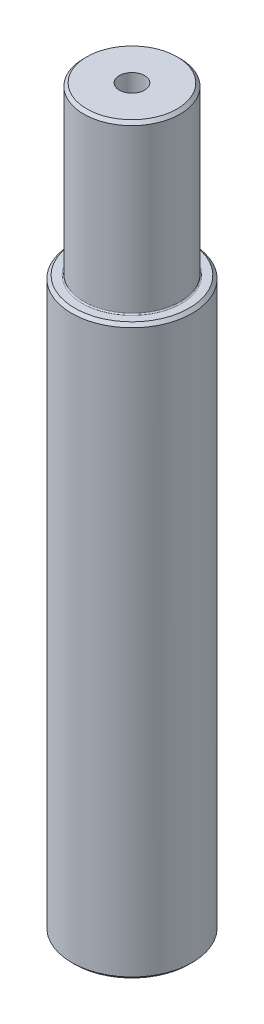
ISO-10303-21;
HEADER;
FILE_DESCRIPTION(('STEP AP214'),'2;1');
FILE_NAME('part.step','',(''),(''),'','','');
FILE_SCHEMA(('AUTOMOTIVE_DESIGN { 1 0 10303 214 1 1 1 1 }'));
ENDSEC;
DATA;
#1=APPLICATION_CONTEXT('core data for automotive mechanical design processes');
#2=APPLICATION_PROTOCOL_DEFINITION('international standard','automotive_design',2000,#1);
#3=PRODUCT_CONTEXT('',#1,'mechanical');
#4=PRODUCT('Part','Part','',(#3));
#5=PRODUCT_RELATED_PRODUCT_CATEGORY('part','',(#4));
#6=PRODUCT_DEFINITION_FORMATION('','',#4);
#7=PRODUCT_DEFINITION_CONTEXT('part definition',#1,'design');
#8=PRODUCT_DEFINITION('design','',#6,#7);
#9=PRODUCT_DEFINITION_SHAPE('','',#8);
#10=(LENGTH_UNIT() NAMED_UNIT(*) SI_UNIT(.MILLI.,.METRE.));
#11=(NAMED_UNIT(*) PLANE_ANGLE_UNIT() SI_UNIT($,.RADIAN.));
#12=(NAMED_UNIT(*) SI_UNIT($,.STERADIAN.) SOLID_ANGLE_UNIT());
#13=UNCERTAINTY_MEASURE_WITH_UNIT(LENGTH_MEASURE(1.E-05),#10,'distance_accuracy_value','');
#14=(GEOMETRIC_REPRESENTATION_CONTEXT(3) GLOBAL_UNCERTAINTY_ASSIGNED_CONTEXT((#13)) GLOBAL_UNIT_ASSIGNED_CONTEXT((#10,
#11,#12)) REPRESENTATION_CONTEXT('',''));
#15=CARTESIAN_POINT('',(0.,0.,0.));
#16=DIRECTION('',(0.,0.,1.));
#17=DIRECTION('',(1.,0.,0.));
#18=AXIS2_PLACEMENT_3D('',#15,#16,#17);
#19=CARTESIAN_POINT('',(0.,0.,0.));
#20=DIRECTION('',(0.,1.,0.));
#21=DIRECTION('',(0.,0.,1.));
#22=AXIS2_PLACEMENT_3D('',#19,#20,#21);
#23=PLANE('',#22);
#24=CARTESIAN_POINT('',(0.,0.,0.));
#25=DIRECTION('',(0.,1.,0.));
#26=DIRECTION('',(0.,0.,1.));
#27=AXIS2_PLACEMENT_3D('',#24,#25,#26);
#28=CIRCLE('',#27,9.49999999999999);
#29=CARTESIAN_POINT('',(0.,0.,9.49999999999999));
#30=VERTEX_POINT('',#29);
#31=EDGE_CURVE('E101',#30,#30,#28,.F.);
#32=ORIENTED_EDGE('',*,*,#31,.T.);
#33=EDGE_LOOP('',(#32));
#34=FACE_BOUND('',#33,.T.);
#35=CARTESIAN_POINT('',(0.,0.,0.));
#36=DIRECTION('',(0.,-1.,0.));
#37=DIRECTION('',(0.,0.,-1.));
#38=AXIS2_PLACEMENT_3D('',#35,#36,#37);
#39=CIRCLE('',#38,2.1);
#40=CARTESIAN_POINT('',(0.,0.,-2.1));
#41=VERTEX_POINT('',#40);
#42=EDGE_CURVE('E71',#41,#41,#39,.T.);
#43=ORIENTED_EDGE('',*,*,#42,.F.);
#44=EDGE_LOOP('',(#43));
#45=FACE_BOUND('',#44,.T.);
#46=ADVANCED_FACE('F45',(#34,#45),#23,.F.);
#47=CARTESIAN_POINT('',(0.,7.47619047619048,0.));
#48=DIRECTION('',(0.,1.,0.));
#49=DIRECTION('',(0.,0.,1.));
#50=AXIS2_PLACEMENT_3D('',#47,#48,#49);
#51=CYLINDRICAL_SURFACE('',#50,10.);
#52=CARTESIAN_POINT('',(0.,0.500000000000013,0.));
#53=DIRECTION('',(0.,1.,0.));
#54=DIRECTION('',(0.,0.,1.));
#55=AXIS2_PLACEMENT_3D('',#52,#53,#54);
#56=CIRCLE('',#55,10.);
#57=CARTESIAN_POINT('',(0.,0.500000000000013,10.));
#58=VERTEX_POINT('',#57);
#59=EDGE_CURVE('E97',#58,#58,#56,.T.);
#60=ORIENTED_EDGE('',*,*,#59,.T.);
#61=EDGE_LOOP('',(#60));
#62=FACE_BOUND('',#61,.T.);
#63=CARTESIAN_POINT('',(0.,93.85,0.));
#64=DIRECTION('',(0.,-1.,0.));
#65=DIRECTION('',(0.,0.,-1.));
#66=AXIS2_PLACEMENT_3D('',#63,#64,#65);
#67=CIRCLE('',#66,10.);
#68=CARTESIAN_POINT('',(0.,93.85,-10.));
#69=VERTEX_POINT('',#68);
#70=EDGE_CURVE('E93',#69,#69,#67,.T.);
#71=ORIENTED_EDGE('',*,*,#70,.T.);
#72=EDGE_LOOP('',(#71));
#73=FACE_BOUND('',#72,.T.);
#74=ADVANCED_FACE('F125',(#62,#73),#51,.T.);
#75=CARTESIAN_POINT('',(10.,94.35,0.));
#76=DIRECTION('',(0.,-1.,0.));
#77=DIRECTION('',(0.,0.,-1.));
#78=AXIS2_PLACEMENT_3D('',#75,#76,#77);
#79=PLANE('',#78);
#80=CARTESIAN_POINT('',(0.,94.35,0.));
#81=DIRECTION('',(0.,-1.,0.));
#82=DIRECTION('',(0.,0.,-1.));
#83=AXIS2_PLACEMENT_3D('',#80,#81,#82);
#84=CIRCLE('',#83,9.49999999999999);
#85=CARTESIAN_POINT('',(0.,94.35,-9.49999999999999));
#86=VERTEX_POINT('',#85);
#87=EDGE_CURVE('E105',#86,#86,#84,.F.);
#88=ORIENTED_EDGE('',*,*,#87,.T.);
#89=EDGE_LOOP('',(#88));
#90=FACE_BOUND('',#89,.T.);
#91=CARTESIAN_POINT('',(0.,94.35,0.));
#92=DIRECTION('',(0.,-1.,0.));
#93=DIRECTION('',(0.,0.,-1.));
#94=AXIS2_PLACEMENT_3D('',#91,#92,#93);
#95=CIRCLE('',#94,8.2);
#96=CARTESIAN_POINT('',(0.,94.35,-8.2));
#97=VERTEX_POINT('',#96);
#98=EDGE_CURVE('E89',#97,#97,#95,.T.);
#99=ORIENTED_EDGE('',*,*,#98,.T.);
#100=EDGE_LOOP('',(#99));
#101=FACE_BOUND('',#100,.T.);
#102=ADVANCED_FACE('F131',(#90,#101),#79,.F.);
#103=CARTESIAN_POINT('',(0.,7.47619047619048,0.));
#104=DIRECTION('',(0.,1.,0.));
#105=DIRECTION('',(0.,0.,1.));
#106=AXIS2_PLACEMENT_3D('',#103,#104,#105);
#107=CYLINDRICAL_SURFACE('',#106,8.);
#108=CARTESIAN_POINT('',(0.,121.5,0.));
#109=DIRECTION('',(0.,-1.,0.));
#110=DIRECTION('',(0.,0.,-1.));
#111=AXIS2_PLACEMENT_3D('',#108,#109,#110);
#112=CIRCLE('',#111,8.);
#113=CARTESIAN_POINT('',(0.,121.5,-8.));
#114=VERTEX_POINT('',#113);
#115=EDGE_CURVE('E11',#114,#114,#112,.T.);
#116=ORIENTED_EDGE('',*,*,#115,.T.);
#117=EDGE_LOOP('',(#116));
#118=FACE_BOUND('',#117,.T.);
#119=CARTESIAN_POINT('',(0.,94.55,0.));
#120=DIRECTION('',(0.,-1.,0.));
#121=DIRECTION('',(0.,0.,-1.));
#122=AXIS2_PLACEMENT_3D('',#119,#120,#121);
#123=CIRCLE('',#122,8.);
#124=CARTESIAN_POINT('',(0.,94.55,-8.));
#125=VERTEX_POINT('',#124);
#126=EDGE_CURVE('E85',#125,#125,#123,.F.);
#127=ORIENTED_EDGE('',*,*,#126,.T.);
#128=EDGE_LOOP('',(#127));
#129=FACE_BOUND('',#128,.T.);
#130=ADVANCED_FACE('F155',(#118,#129),#107,.T.);
#131=CARTESIAN_POINT('',(8.,122.,0.));
#132=DIRECTION('',(0.,-1.,0.));
#133=DIRECTION('',(0.,0.,-1.));
#134=AXIS2_PLACEMENT_3D('',#131,#132,#133);
#135=PLANE('',#134);
#136=CARTESIAN_POINT('',(0.,122.,0.));
#137=DIRECTION('',(0.,-1.,0.));
#138=DIRECTION('',(0.,0.,-1.));
#139=AXIS2_PLACEMENT_3D('',#136,#137,#138);
#140=CIRCLE('',#139,7.49999999999998);
#141=CARTESIAN_POINT('',(0.,122.,-7.49999999999998));
#142=VERTEX_POINT('',#141);
#143=EDGE_CURVE('E54',#142,#142,#140,.F.);
#144=ORIENTED_EDGE('',*,*,#143,.T.);
#145=EDGE_LOOP('',(#144));
#146=FACE_BOUND('',#145,.T.);
#147=CARTESIAN_POINT('',(0.,122.,0.));
#148=DIRECTION('',(0.,1.,0.));
#149=DIRECTION('',(0.,0.,1.));
#150=AXIS2_PLACEMENT_3D('',#147,#148,#149);
#151=CIRCLE('',#150,2.1);
#152=CARTESIAN_POINT('',(0.,122.,2.1));
#153=VERTEX_POINT('',#152);
#154=EDGE_CURVE('E72',#153,#153,#151,.T.);
#155=ORIENTED_EDGE('',*,*,#154,.F.);
#156=EDGE_LOOP('',(#155));
#157=FACE_BOUND('',#156,.T.);
#158=ADVANCED_FACE('F112',(#146,#157),#135,.F.);
#159=CARTESIAN_POINT('',(0.,12.4,0.));
#160=DIRECTION('',(0.,-1.,0.));
#161=DIRECTION('',(0.,0.,-1.));
#162=AXIS2_PLACEMENT_3D('',#159,#160,#161);
#163=CONICAL_SURFACE('',#162,2.1,1.02974425867665);
#164=CARTESIAN_POINT('',(0.,13.6618072999579,0.));
#165=VERTEX_POINT('',#164);
#166=VERTEX_LOOP('',#165);
#167=FACE_BOUND('',#166,.T.);
#168=CARTESIAN_POINT('',(0.,12.4,0.));
#169=DIRECTION('',(0.,-1.,0.));
#170=DIRECTION('',(0.,0.,-1.));
#171=AXIS2_PLACEMENT_3D('',#168,#169,#170);
#172=CIRCLE('',#171,2.1);
#173=CARTESIAN_POINT('',(0.,12.4,-2.1));
#174=VERTEX_POINT('',#173);
#175=EDGE_CURVE('E77',#174,#174,#172,.T.);
#176=ORIENTED_EDGE('',*,*,#175,.T.);
#177=EDGE_LOOP('',(#176));
#178=FACE_BOUND('',#177,.T.);
#179=ADVANCED_FACE('F166',(#167,#178),#163,.F.);
#180=CARTESIAN_POINT('',(0.,0.,0.));
#181=DIRECTION('',(0.,-1.,0.));
#182=DIRECTION('',(0.,0.,-1.));
#183=AXIS2_PLACEMENT_3D('',#180,#181,#182);
#184=CYLINDRICAL_SURFACE('',#183,2.1);
#185=ORIENTED_EDGE('',*,*,#175,.F.);
#186=EDGE_LOOP('',(#185));
#187=FACE_BOUND('',#186,.T.);
#188=ORIENTED_EDGE('',*,*,#42,.T.);
#189=EDGE_LOOP('',(#188));
#190=FACE_BOUND('',#189,.T.);
#191=ADVANCED_FACE('F64',(#187,#190),#184,.F.);
#192=CARTESIAN_POINT('',(0.,109.6,0.));
#193=DIRECTION('',(0.,1.,0.));
#194=DIRECTION('',(0.,0.,1.));
#195=AXIS2_PLACEMENT_3D('',#192,#193,#194);
#196=CONICAL_SURFACE('',#195,2.1,1.02974425867665);
#197=CARTESIAN_POINT('',(0.,108.338192700042,0.));
#198=VERTEX_POINT('',#197);
#199=VERTEX_LOOP('',#198);
#200=FACE_BOUND('',#199,.T.);
#201=CARTESIAN_POINT('',(0.,109.6,0.));
#202=DIRECTION('',(0.,1.,0.));
#203=DIRECTION('',(0.,0.,1.));
#204=AXIS2_PLACEMENT_3D('',#201,#202,#203);
#205=CIRCLE('',#204,2.1);
#206=CARTESIAN_POINT('',(0.,109.6,2.1));
#207=VERTEX_POINT('',#206);
#208=EDGE_CURVE('E68',#207,#207,#205,.T.);
#209=ORIENTED_EDGE('',*,*,#208,.T.);
#210=EDGE_LOOP('',(#209));
#211=FACE_BOUND('',#210,.T.);
#212=ADVANCED_FACE('F60',(#200,#211),#196,.F.);
#213=CARTESIAN_POINT('',(0.,122.,0.));
#214=DIRECTION('',(0.,1.,0.));
#215=DIRECTION('',(0.,0.,1.));
#216=AXIS2_PLACEMENT_3D('',#213,#214,#215);
#217=CYLINDRICAL_SURFACE('',#216,2.1);
#218=ORIENTED_EDGE('',*,*,#208,.F.);
#219=EDGE_LOOP('',(#218));
#220=FACE_BOUND('',#219,.T.);
#221=ORIENTED_EDGE('',*,*,#154,.T.);
#222=EDGE_LOOP('',(#221));
#223=FACE_BOUND('',#222,.T.);
#224=ADVANCED_FACE('F63',(#220,#223),#217,.F.);
#225=CARTESIAN_POINT('',(0.,94.55,0.));
#226=DIRECTION('',(0.,-1.,0.));
#227=DIRECTION('',(0.,0.,-1.));
#228=AXIS2_PLACEMENT_3D('',#225,#226,#227);
#229=TOROIDAL_SURFACE('',#228,8.2,0.2);
#230=ORIENTED_EDGE('',*,*,#98,.F.);
#231=EDGE_LOOP('',(#230));
#232=FACE_BOUND('',#231,.T.);
#233=ORIENTED_EDGE('',*,*,#126,.F.);
#234=EDGE_LOOP('',(#233));
#235=FACE_BOUND('',#234,.T.);
#236=ADVANCED_FACE('F137',(#232,#235),#229,.F.);
#237=CARTESIAN_POINT('',(0.,0.500000000000013,0.));
#238=DIRECTION('',(0.,1.,0.));
#239=DIRECTION('',(0.,0.,1.));
#240=AXIS2_PLACEMENT_3D('',#237,#238,#239);
#241=CONICAL_SURFACE('',#240,10.,0.785398163397441);
#242=ORIENTED_EDGE('',*,*,#31,.F.);
#243=EDGE_LOOP('',(#242));
#244=FACE_BOUND('',#243,.T.);
#245=ORIENTED_EDGE('',*,*,#59,.F.);
#246=EDGE_LOOP('',(#245));
#247=FACE_BOUND('',#246,.T.);
#248=ADVANCED_FACE('F121',(#244,#247),#241,.T.);
#249=CARTESIAN_POINT('',(0.,94.35,0.));
#250=DIRECTION('',(0.,-1.,0.));
#251=DIRECTION('',(0.,0.,-1.));
#252=AXIS2_PLACEMENT_3D('',#249,#250,#251);
#253=CONICAL_SURFACE('',#252,9.49999999999999,0.78539816339744);
#254=ORIENTED_EDGE('',*,*,#70,.F.);
#255=EDGE_LOOP('',(#254));
#256=FACE_BOUND('',#255,.T.);
#257=ORIENTED_EDGE('',*,*,#87,.F.);
#258=EDGE_LOOP('',(#257));
#259=FACE_BOUND('',#258,.T.);
#260=ADVANCED_FACE('F116',(#256,#259),#253,.T.);
#261=CARTESIAN_POINT('',(0.,122.,0.));
#262=DIRECTION('',(0.,-1.,0.));
#263=DIRECTION('',(0.,0.,-1.));
#264=AXIS2_PLACEMENT_3D('',#261,#262,#263);
#265=CONICAL_SURFACE('',#264,7.49999999999998,0.785398163397455);
#266=ORIENTED_EDGE('',*,*,#115,.F.);
#267=EDGE_LOOP('',(#266));
#268=FACE_BOUND('',#267,.T.);
#269=ORIENTED_EDGE('',*,*,#143,.F.);
#270=EDGE_LOOP('',(#269));
#271=FACE_BOUND('',#270,.T.);
#272=ADVANCED_FACE('F47',(#268,#271),#265,.T.);
#273=CLOSED_SHELL('',(#46,#74,#102,#130,#158,#179,#191,#212,#224,#236,#248,#260,#272));
#274=MANIFOLD_SOLID_BREP('B2',#273);
#275=ADVANCED_BREP_SHAPE_REPRESENTATION('',(#18,#274),#14);
#276=SHAPE_DEFINITION_REPRESENTATION(#9,#275);
ENDSEC;
END-ISO-10303-21;
